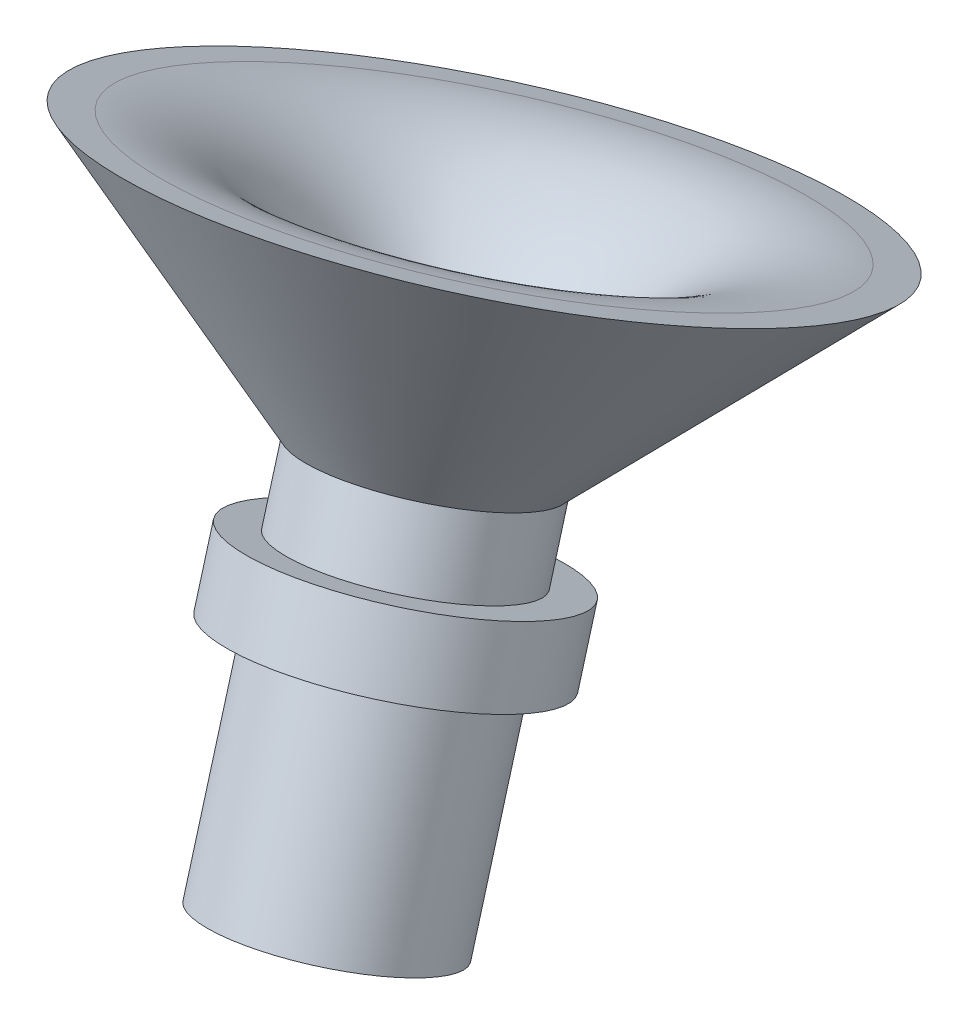
ISO-10303-21;
HEADER;
FILE_DESCRIPTION(('STEP AP214'),'2;1');
FILE_NAME('part.step','',(''),(''),'','','');
FILE_SCHEMA(('AUTOMOTIVE_DESIGN { 1 0 10303 214 1 1 1 1 }'));
ENDSEC;
DATA;
#1=APPLICATION_CONTEXT('core data for automotive mechanical design processes');
#2=APPLICATION_PROTOCOL_DEFINITION('international standard','automotive_design',2000,#1);
#3=PRODUCT_CONTEXT('',#1,'mechanical');
#4=PRODUCT('Part','Part','',(#3));
#5=PRODUCT_RELATED_PRODUCT_CATEGORY('part','',(#4));
#6=PRODUCT_DEFINITION_FORMATION('','',#4);
#7=PRODUCT_DEFINITION_CONTEXT('part definition',#1,'design');
#8=PRODUCT_DEFINITION('design','',#6,#7);
#9=PRODUCT_DEFINITION_SHAPE('','',#8);
#10=(LENGTH_UNIT() NAMED_UNIT(*) SI_UNIT(.MILLI.,.METRE.));
#11=(NAMED_UNIT(*) PLANE_ANGLE_UNIT() SI_UNIT($,.RADIAN.));
#12=(NAMED_UNIT(*) SI_UNIT($,.STERADIAN.) SOLID_ANGLE_UNIT());
#13=UNCERTAINTY_MEASURE_WITH_UNIT(LENGTH_MEASURE(1.E-05),#10,'distance_accuracy_value','');
#14=(GEOMETRIC_REPRESENTATION_CONTEXT(3) GLOBAL_UNCERTAINTY_ASSIGNED_CONTEXT((#13)) GLOBAL_UNIT_ASSIGNED_CONTEXT((#10,
#11,#12)) REPRESENTATION_CONTEXT('',''));
#15=CARTESIAN_POINT('',(0.,0.,0.));
#16=DIRECTION('',(0.,0.,1.));
#17=DIRECTION('',(1.,0.,0.));
#18=AXIS2_PLACEMENT_3D('',#15,#16,#17);
#19=CARTESIAN_POINT('',(-20.1513332773474,35.9151658884174,4.65068208851449));
#20=DIRECTION('',(0.10380954475083,-0.916038966713815,0.387422495320692));
#21=DIRECTION('',(0.,0.389527034298012,0.921015032206856));
#22=AXIS2_PLACEMENT_3D('',#19,#20,#21);
#23=PLANE('',#22);
#24=CARTESIAN_POINT('',(-17.2535557984802,35.9151658884174,3.87422495320692));
#25=DIRECTION('',(-0.10380954475083,0.916038966713815,-0.387422495320692));
#26=DIRECTION('',(0.,0.389527034298012,0.921015032206856));
#27=AXIS2_PLACEMENT_3D('',#24,#25,#26);
#28=CIRCLE('',#27,3.);
#29=CARTESIAN_POINT('',(-17.2535557984802,37.0837469913114,6.63727004982749));
#30=VERTEX_POINT('',#29);
#31=EDGE_CURVE('E10',#30,#30,#28,.T.);
#32=ORIENTED_EDGE('',*,*,#31,.F.);
#33=EDGE_LOOP('',(#32));
#34=FACE_BOUND('',#33,.T.);
#35=CARTESIAN_POINT('',(-17.2535557984802,35.9151658884174,3.87422495320692));
#36=DIRECTION('',(-0.10380954475083,0.916038966713815,-0.387422495320692));
#37=DIRECTION('',(0.,0.389527034298012,0.921015032206856));
#38=AXIS2_PLACEMENT_3D('',#35,#36,#37);
#39=CIRCLE('',#38,2.05);
#40=CARTESIAN_POINT('',(-17.2535557984802,36.7136963087283,5.76230576923098));
#41=VERTEX_POINT('',#40);
#42=EDGE_CURVE('E85',#41,#41,#39,.T.);
#43=ORIENTED_EDGE('',*,*,#42,.T.);
#44=EDGE_LOOP('',(#43));
#45=FACE_BOUND('',#44,.T.);
#46=ADVANCED_FACE('F39',(#34,#45),#23,.T.);
#47=CARTESIAN_POINT('',(-17.2535557984802,35.9151658884174,3.87422495320692));
#48=DIRECTION('',(0.10380954475083,-0.916038966713815,0.387422495320692));
#49=DIRECTION('',(0.,0.389527034298012,0.921015032206856));
#50=AXIS2_PLACEMENT_3D('',#47,#48,#49);
#51=CYLINDRICAL_SURFACE('',#50,3.);
#52=CARTESIAN_POINT('',(-17.8764130669852,41.4113996887003,1.54968998128277));
#53=DIRECTION('',(-0.10380954475083,0.916038966713815,-0.387422495320692));
#54=DIRECTION('',(0.,0.389527034298012,0.921015032206856));
#55=AXIS2_PLACEMENT_3D('',#52,#53,#54);
#56=CIRCLE('',#55,3.);
#57=CARTESIAN_POINT('',(-17.8764130669852,42.5799807915943,4.31273507790334));
#58=VERTEX_POINT('',#57);
#59=EDGE_CURVE('E44',#58,#58,#56,.T.);
#60=ORIENTED_EDGE('',*,*,#59,.F.);
#61=EDGE_LOOP('',(#60));
#62=FACE_BOUND('',#61,.T.);
#63=ORIENTED_EDGE('',*,*,#31,.T.);
#64=EDGE_LOOP('',(#63));
#65=FACE_BOUND('',#64,.T.);
#66=ADVANCED_FACE('F121',(#62,#65),#51,.T.);
#67=CARTESIAN_POINT('',(-21.7401163721415,41.4113996887003,2.58496616169287));
#68=DIRECTION('',(0.10380954475083,-0.916038966713815,0.387422495320692));
#69=DIRECTION('',(0.,0.389527034298012,0.921015032206856));
#70=AXIS2_PLACEMENT_3D('',#67,#68,#69);
#71=PLANE('',#70);
#72=CARTESIAN_POINT('',(-17.8764130669852,41.4113996887003,1.54968998128277));
#73=DIRECTION('',(-0.10380954475083,0.916038966713815,-0.387422495320692));
#74=DIRECTION('',(0.,0.389527034298012,0.921015032206856));
#75=AXIS2_PLACEMENT_3D('',#72,#73,#74);
#76=CIRCLE('',#75,3.99999999999999);
#77=CARTESIAN_POINT('',(-17.8764130669852,42.9695078258923,5.23375011011019));
#78=VERTEX_POINT('',#77);
#79=EDGE_CURVE('E47',#78,#78,#76,.T.);
#80=ORIENTED_EDGE('',*,*,#79,.F.);
#81=EDGE_LOOP('',(#80));
#82=FACE_BOUND('',#81,.T.);
#83=ORIENTED_EDGE('',*,*,#59,.T.);
#84=EDGE_LOOP('',(#83));
#85=FACE_BOUND('',#84,.T.);
#86=ADVANCED_FACE('F125',(#82,#85),#71,.T.);
#87=CARTESIAN_POINT('',(-17.2535557984802,35.9151658884174,3.87422495320692));
#88=DIRECTION('',(0.10380954475083,-0.916038966713815,0.387422495320692));
#89=DIRECTION('',(0.,0.389527034298012,0.921015032206856));
#90=AXIS2_PLACEMENT_3D('',#87,#88,#89);
#91=CYLINDRICAL_SURFACE('',#90,4.);
#92=CARTESIAN_POINT('',(-18.0840321564869,43.2434776221279,0.774844990641381));
#93=DIRECTION('',(-0.10380954475083,0.916038966713815,-0.387422495320692));
#94=DIRECTION('',(0.,0.389527034298012,0.921015032206856));
#95=AXIS2_PLACEMENT_3D('',#92,#93,#94);
#96=CIRCLE('',#95,4.);
#97=CARTESIAN_POINT('',(-18.0840321564869,44.80158575932,4.4589051194688));
#98=VERTEX_POINT('',#97);
#99=EDGE_CURVE('E52',#98,#98,#96,.T.);
#100=ORIENTED_EDGE('',*,*,#99,.F.);
#101=EDGE_LOOP('',(#100));
#102=FACE_BOUND('',#101,.T.);
#103=ORIENTED_EDGE('',*,*,#79,.T.);
#104=EDGE_LOOP('',(#103));
#105=FACE_BOUND('',#104,.T.);
#106=ADVANCED_FACE('F117',(#102,#105),#91,.T.);
#107=CARTESIAN_POINT('',(-20.9818096353541,43.2434776221279,1.55130212594895));
#108=DIRECTION('',(-0.10380954475083,0.916038966713815,-0.387422495320692));
#109=DIRECTION('',(0.,-0.389527034298012,-0.921015032206856));
#110=AXIS2_PLACEMENT_3D('',#107,#108,#109);
#111=PLANE('',#110);
#112=CARTESIAN_POINT('',(-18.0840321564869,43.2434776221279,0.774844990641381));
#113=DIRECTION('',(-0.10380954475083,0.916038966713815,-0.387422495320692));
#114=DIRECTION('',(0.,0.389527034298012,0.921015032206856));
#115=AXIS2_PLACEMENT_3D('',#112,#113,#114);
#116=CIRCLE('',#115,3.);
#117=CARTESIAN_POINT('',(-18.0840321564869,44.412058725022,3.53789008726195));
#118=VERTEX_POINT('',#117);
#119=EDGE_CURVE('E59',#118,#118,#116,.T.);
#120=ORIENTED_EDGE('',*,*,#119,.F.);
#121=EDGE_LOOP('',(#120));
#122=FACE_BOUND('',#121,.T.);
#123=ORIENTED_EDGE('',*,*,#99,.T.);
#124=EDGE_LOOP('',(#123));
#125=FACE_BOUND('',#124,.T.);
#126=ADVANCED_FACE('F111',(#122,#125),#111,.T.);
#127=CARTESIAN_POINT('',(-17.2535557984802,35.9151658884174,3.87422495320692));
#128=DIRECTION('',(0.10380954475083,-0.916038966713815,0.387422495320692));
#129=DIRECTION('',(0.,0.389527034298012,0.921015032206856));
#130=AXIS2_PLACEMENT_3D('',#127,#128,#129);
#131=CYLINDRICAL_SURFACE('',#130,3.);
#132=CARTESIAN_POINT('',(-18.2916512459885,45.0755555555555,0.));
#133=DIRECTION('',(-0.10380954475083,0.916038966713815,-0.387422495320692));
#134=DIRECTION('',(0.,0.389527034298012,0.921015032206856));
#135=AXIS2_PLACEMENT_3D('',#132,#133,#134);
#136=CIRCLE('',#135,3.);
#137=CARTESIAN_POINT('',(-18.2916512459885,43.9069744526615,-2.76304509662056));
#138=VERTEX_POINT('',#137);
#139=EDGE_CURVE('E61',#138,#138,#136,.T.);
#140=ORIENTED_EDGE('',*,*,#139,.F.);
#141=EDGE_LOOP('',(#140));
#142=FACE_BOUND('',#141,.T.);
#143=ORIENTED_EDGE('',*,*,#119,.T.);
#144=EDGE_LOOP('',(#143));
#145=FACE_BOUND('',#144,.T.);
#146=ADVANCED_FACE('F109',(#142,#145),#131,.T.);
#147=CARTESIAN_POINT('',(-18.2916512459885,45.0755555555555,0.));
#148=DIRECTION('',(-0.10380954475083,0.916038966713815,-0.387422495320692));
#149=DIRECTION('',(0.,-0.389527034298012,-0.921015032206856));
#150=AXIS2_PLACEMENT_3D('',#147,#148,#149);
#151=CONICAL_SURFACE('',#150,3.,0.793662438057099);
#152=CARTESIAN_POINT('',(-18.9145085144935,50.5717893558384,-2.32453497192415));
#153=DIRECTION('',(-0.10380954475083,0.916038966713815,-0.387422495320692));
#154=DIRECTION('',(0.,0.389527034298012,0.921015032206856));
#155=AXIS2_PLACEMENT_3D('',#152,#153,#154);
#156=CIRCLE('',#155,9.09999999999999);
#157=CARTESIAN_POINT('',(-18.9145085144935,47.0270933437265,-10.7057717650065));
#158=VERTEX_POINT('',#157);
#159=EDGE_CURVE('E63',#158,#158,#156,.T.);
#160=CARTESIAN_POINT('',(-18.9145085144935,47.0270933437265,-10.7057717650065));
#161=CARTESIAN_POINT('',(-18.9080204179466,46.9945921052779,-10.6230350288775));
#162=CARTESIAN_POINT('',(-18.9015323213996,46.9620908668293,-10.5402982927485));
#163=CARTESIAN_POINT('',(-18.8885561283058,46.8970883899322,-10.3748248204904));
#164=CARTESIAN_POINT('',(-18.8820680317589,46.8645871514836,-10.2920880843614));
#165=CARTESIAN_POINT('',(-18.869091838665,46.7995846745864,-10.1266146121034));
#166=CARTESIAN_POINT('',(-18.8626037421181,46.7670834361378,-10.0438778759744));
#167=CARTESIAN_POINT('',(-18.8496275490242,46.7020809592406,-9.87840440371632));
#168=CARTESIAN_POINT('',(-18.8431394524773,46.669579720792,-9.7956676675873));
#169=CARTESIAN_POINT('',(-18.8301632593835,46.6045772438948,-9.63019419532927));
#170=CARTESIAN_POINT('',(-18.8236751628365,46.5720760054462,-9.54745745920024));
#171=CARTESIAN_POINT('',(-18.8106989697427,46.507073528549,-9.3819839869422));
#172=CARTESIAN_POINT('',(-18.8042108731957,46.4745722901004,-9.29924725081318));
#173=CARTESIAN_POINT('',(-18.7912346801019,46.4095698132032,-9.13377377855514));
#174=CARTESIAN_POINT('',(-18.784746583555,46.3770685747547,-9.05103704242612));
#175=CARTESIAN_POINT('',(-18.7717703904611,46.3120660978575,-8.88556357016808));
#176=CARTESIAN_POINT('',(-18.7652822939142,46.2795648594089,-8.80282683403906));
#177=CARTESIAN_POINT('',(-18.7523061008203,46.2145623825117,-8.63735336178102));
#178=CARTESIAN_POINT('',(-18.7458180042734,46.1820611440631,-8.554616625652));
#179=CARTESIAN_POINT('',(-18.7328418111795,46.1170586671659,-8.38914315339396));
#180=CARTESIAN_POINT('',(-18.7263537146326,46.0845574287173,-8.30640641726493));
#181=CARTESIAN_POINT('',(-18.7133775215388,46.0195549518201,-8.14093294500689));
#182=CARTESIAN_POINT('',(-18.7068894249918,45.9870537133715,-8.05819620887787));
#183=CARTESIAN_POINT('',(-18.693913231898,45.9220512364743,-7.89272273661983));
#184=CARTESIAN_POINT('',(-18.6874251353511,45.8895499980257,-7.80998600049081));
#185=CARTESIAN_POINT('',(-18.6744489422572,45.8245475211286,-7.64451252823277));
#186=CARTESIAN_POINT('',(-18.6679608457103,45.79204628268,-7.56177579210375));
#187=CARTESIAN_POINT('',(-18.6549846526164,45.7270438057828,-7.39630231984571));
#188=CARTESIAN_POINT('',(-18.6484965560695,45.6945425673342,-7.31356558371669));
#189=CARTESIAN_POINT('',(-18.6355203629756,45.629540090437,-7.14809211145865));
#190=CARTESIAN_POINT('',(-18.6290322664287,45.5970388519884,-7.06535537532963));
#191=CARTESIAN_POINT('',(-18.6160560733349,45.5320363750912,-6.89988190307159));
#192=CARTESIAN_POINT('',(-18.6095679767879,45.4995351366426,-6.81714516694257));
#193=CARTESIAN_POINT('',(-18.5965917836941,45.4345326597454,-6.65167169468452));
#194=CARTESIAN_POINT('',(-18.5901036871472,45.4020314212968,-6.5689349585555));
#195=CARTESIAN_POINT('',(-18.5771274940533,45.3370289443996,-6.40346148629746));
#196=CARTESIAN_POINT('',(-18.5706393975064,45.3045277059511,-6.32072475016844));
#197=CARTESIAN_POINT('',(-18.5576632044125,45.2395252290539,-6.1552512779104));
#198=CARTESIAN_POINT('',(-18.5511751078656,45.2070239906053,-6.07251454178138));
#199=CARTESIAN_POINT('',(-18.5381989147717,45.1420215137081,-5.90704106952334));
#200=CARTESIAN_POINT('',(-18.5317108182248,45.1095202752595,-5.82430433339432));
#201=CARTESIAN_POINT('',(-18.518734625131,45.0445177983623,-5.65883086113628));
#202=CARTESIAN_POINT('',(-18.512246528584,45.0120165599137,-5.57609412500726));
#203=CARTESIAN_POINT('',(-18.4992703354902,44.9470140830165,-5.41062065274922));
#204=CARTESIAN_POINT('',(-18.4927822389432,44.9145128445679,-5.3278839166202));
#205=CARTESIAN_POINT('',(-18.4798060458494,44.8495103676707,-5.16241044436216));
#206=CARTESIAN_POINT('',(-18.4733179493025,44.8170091292221,-5.07967370823314));
#207=CARTESIAN_POINT('',(-18.4603417562086,44.752006652325,-4.91420023597509));
#208=CARTESIAN_POINT('',(-18.4538536596617,44.7195054138764,-4.83146349984607));
#209=CARTESIAN_POINT('',(-18.4408774665678,44.6545029369792,-4.66599002758803));
#210=CARTESIAN_POINT('',(-18.4343893700209,44.6220016985306,-4.58325329145901));
#211=CARTESIAN_POINT('',(-18.4214131769271,44.5569992216334,-4.41777981920097));
#212=CARTESIAN_POINT('',(-18.4149250803801,44.5244979831848,-4.33504308307195));
#213=CARTESIAN_POINT('',(-18.4019488872863,44.4594955062876,-4.16956961081391));
#214=CARTESIAN_POINT('',(-18.3954607907393,44.426994267839,-4.08683287468489));
#215=CARTESIAN_POINT('',(-18.3824845976455,44.3619917909418,-3.92135940242685));
#216=CARTESIAN_POINT('',(-18.3759965010986,44.3294905524932,-3.83862266629783));
#217=CARTESIAN_POINT('',(-18.3630203080047,44.264488075596,-3.67314919403979));
#218=CARTESIAN_POINT('',(-18.3565322114578,44.2319868371475,-3.59041245791077));
#219=CARTESIAN_POINT('',(-18.3435560183639,44.1669843602503,-3.42493898565273));
#220=CARTESIAN_POINT('',(-18.337067921817,44.1344831218017,-3.34220224952371));
#221=CARTESIAN_POINT('',(-18.3240917287232,44.0694806449045,-3.17672877726566));
#222=CARTESIAN_POINT('',(-18.3176036321762,44.0369794064559,-3.09399204113664));
#223=CARTESIAN_POINT('',(-18.3046274390824,43.9719769295587,-2.9285185688786));
#224=CARTESIAN_POINT('',(-18.2981393425354,43.9394756911101,-2.84578183274958));
#225=CARTESIAN_POINT('',(-18.2916512459885,43.9069744526615,-2.76304509662056));
#226=B_SPLINE_CURVE_WITH_KNOTS('',3,(#160,#161,#162,#163,#164,#165,#166,#167,#168,#169,#170,
#171,#172,#173,#174,#175,#176,#177,#178,#179,#180,#181,#182,#183,#184,#185,#186,#187,#188,#189,
#190,#191,#192,#193,#194,#195,#196,#197,#198,#199,#200,#201,#202,#203,#204,#205,#206,#207,#208,
#209,#210,#211,#212,#213,#214,#215,#216,#217,#218,#219,#220,#221,#222,#223,#224,#225),
.UNSPECIFIED.,.F.,.F.,(4,2,2,2,2,2,2,2,2,2,2,2,2,2,2,2,2,2,2,2,2,2,2,2,2,2,2,2,2,2,2,2,4),(0.,
0.267383882507905,0.534767765015809,0.802151647523712,1.06953553003161,1.33691941253951,
1.60430329504742,1.87168717755532,2.13907106006323,2.40645494257113,2.67383882507903,
2.94122270758693,3.20860659009484,3.47599047260274,3.74337435511064,4.01075823761855,
4.27814212012645,4.54552600263435,4.81290988514225,5.08029376765015,5.34767765015805,
5.61506153266596,5.88244541517386,6.14982929768176,6.41721318018967,6.68459706269757,
6.95198094520547,7.21936482771337,7.48674871022128,7.75413259272918,8.02151647523708,
8.28890035774499,8.55628424025289),.UNSPECIFIED.);
#227=EDGE_CURVE('BSEAM106',#158,#138,#226,.T.);
#228=ORIENTED_EDGE('',*,*,#159,.F.);
#229=ORIENTED_EDGE('',*,*,#139,.T.);
#230=ORIENTED_EDGE('',*,*,#227,.T.);
#231=ORIENTED_EDGE('',*,*,#227,.F.);
#232=EDGE_LOOP('',(#228,#230,#229,#231));
#233=FACE_BOUND('',#232,.T.);
#234=ADVANCED_FACE('F106',(#233),#151,.T.);
#235=CARTESIAN_POINT('',(-26.7385077074349,50.5717893558384,-0.22810070659372));
#236=DIRECTION('',(-0.10380954475083,0.916038966713815,-0.387422495320692));
#237=DIRECTION('',(0.,-0.389527034298012,-0.921015032206856));
#238=AXIS2_PLACEMENT_3D('',#235,#236,#237);
#239=PLANE('',#238);
#240=CARTESIAN_POINT('',(-18.9145085144935,50.5717893558384,-2.32453497192416));
#241=DIRECTION('',(-0.10380954475083,0.916038966713815,-0.387422495320692));
#242=DIRECTION('',(0.,0.389527034298012,0.921015032206856));
#243=AXIS2_PLACEMENT_3D('',#240,#241,#242);
#244=CIRCLE('',#243,8.1);
#245=CARTESIAN_POINT('',(-18.9145085144935,53.7269583336523,5.13568678895138));
#246=VERTEX_POINT('',#245);
#247=EDGE_CURVE('E70',#246,#246,#244,.T.);
#248=ORIENTED_EDGE('',*,*,#247,.F.);
#249=EDGE_LOOP('',(#248));
#250=FACE_BOUND('',#249,.T.);
#251=ORIENTED_EDGE('',*,*,#159,.T.);
#252=EDGE_LOOP('',(#251));
#253=FACE_BOUND('',#252,.T.);
#254=ADVANCED_FACE('F105',(#250,#253),#239,.T.);
#255=CARTESIAN_POINT('',(-18.2916512459885,45.0755555555556,0.));
#256=DIRECTION('',(0.10380954475083,-0.916038966713815,0.387422495320692));
#257=DIRECTION('',(0.,0.389527034298012,0.921015032206856));
#258=AXIS2_PLACEMENT_3D('',#255,#256,#257);
#259=TOROIDAL_SURFACE('',#258,8.1,6.);
#260=CARTESIAN_POINT('',(-18.2916512459885,45.0755555555556,0.));
#261=DIRECTION('',(-0.10380954475083,0.916038966713815,-0.387422495320692));
#262=DIRECTION('',(0.,0.389527034298012,0.921015032206856));
#263=AXIS2_PLACEMENT_3D('',#260,#261,#262);
#264=CIRCLE('',#263,2.1);
#265=CARTESIAN_POINT('',(-18.2916512459885,45.8935623275814,1.93413156763439));
#266=VERTEX_POINT('',#265);
#267=EDGE_CURVE('E66',#266,#266,#264,.T.);
#268=ORIENTED_EDGE('',*,*,#267,.F.);
#269=EDGE_LOOP('',(#268));
#270=FACE_BOUND('',#269,.T.);
#271=ORIENTED_EDGE('',*,*,#247,.T.);
#272=EDGE_LOOP('',(#271));
#273=FACE_BOUND('',#272,.T.);
#274=ADVANCED_FACE('F100',(#270,#273),#259,.T.);
#275=CARTESIAN_POINT('',(-20.3200954811956,45.0755555555556,0.543519994715306));
#276=CARTESIAN_POINT('',(-20.2508891180283,44.4648629110797,0.801801658262434));
#277=CARTESIAN_POINT('',(-19.215756928572,43.8541702666038,0.801264276707037));
#278=CARTESIAN_POINT('',(-19.1465505654048,43.2434776221279,1.05954594025416));
#279=B_SPLINE_CURVE_WITH_KNOTS('',3,(#275,#276,#277,#278),.UNSPECIFIED.,.F.,.F.,(4,4),(0.,1.),.UNSPECIFIED.);
#280=CARTESIAN_POINT('',(-17.2535557984802,35.9151658884174,3.87422495320692));
#281=DIRECTION('',(0.10380954475083,-0.916038966713815,0.387422495320692));
#282=AXIS1_PLACEMENT('',#280,#281);
#283=SURFACE_OF_REVOLUTION('',#279,#282);
#284=CARTESIAN_POINT('',(-18.0840321564869,43.2434776221279,0.774844990641378));
#285=DIRECTION('',(-0.10380954475083,0.916038966713815,-0.387422495320692));
#286=DIRECTION('',(0.,0.389527034298012,0.921015032206856));
#287=AXIS2_PLACEMENT_3D('',#284,#285,#286);
#288=CIRCLE('',#287,1.09999999999999);
#289=CARTESIAN_POINT('',(-18.0840321564869,43.6719573598558,1.78796152606891));
#290=VERTEX_POINT('',#289);
#291=EDGE_CURVE('E71',#290,#290,#288,.T.);
#292=ORIENTED_EDGE('',*,*,#291,.F.);
#293=EDGE_LOOP('',(#292));
#294=FACE_BOUND('',#293,.T.);
#295=ORIENTED_EDGE('',*,*,#267,.T.);
#296=EDGE_LOOP('',(#295));
#297=FACE_BOUND('',#296,.T.);
#298=ADVANCED_FACE('F95',(#294,#297),#283,.F.);
#299=CARTESIAN_POINT('',(-17.2535557984802,35.9151658884174,3.87422495320692));
#300=DIRECTION('',(0.10380954475083,-0.916038966713815,0.387422495320692));
#301=DIRECTION('',(0.,0.389527034298012,0.921015032206856));
#302=AXIS2_PLACEMENT_3D('',#299,#300,#301);
#303=CYLINDRICAL_SURFACE('',#302,1.09999999999999);
#304=CARTESIAN_POINT('',(-17.6687939774835,39.5793217552727,2.32453497192415));
#305=DIRECTION('',(-0.10380954475083,0.916038966713815,-0.387422495320692));
#306=DIRECTION('',(0.,0.389527034298012,0.921015032206856));
#307=AXIS2_PLACEMENT_3D('',#304,#305,#306);
#308=CIRCLE('',#307,1.1);
#309=CARTESIAN_POINT('',(-17.6687939774835,40.0078014930005,3.33765150735169));
#310=VERTEX_POINT('',#309);
#311=EDGE_CURVE('E76',#310,#310,#308,.T.);
#312=ORIENTED_EDGE('',*,*,#311,.F.);
#313=EDGE_LOOP('',(#312));
#314=FACE_BOUND('',#313,.T.);
#315=ORIENTED_EDGE('',*,*,#291,.T.);
#316=EDGE_LOOP('',(#315));
#317=FACE_BOUND('',#316,.T.);
#318=ADVANCED_FACE('F96',(#314,#317),#303,.F.);
#319=CARTESIAN_POINT('',(-19.6489419213761,39.5793217552727,2.85511401438433));
#320=DIRECTION('',(0.10380954475083,-0.916038966713815,0.387422495320692));
#321=DIRECTION('',(0.,0.389527034298012,0.921015032206856));
#322=AXIS2_PLACEMENT_3D('',#319,#320,#321);
#323=PLANE('',#322);
#324=CARTESIAN_POINT('',(-17.6687939774835,39.5793217552727,2.32453497192415));
#325=DIRECTION('',(-0.10380954475083,0.916038966713815,-0.387422495320692));
#326=DIRECTION('',(0.,0.389527034298012,0.921015032206856));
#327=AXIS2_PLACEMENT_3D('',#324,#325,#326);
#328=CIRCLE('',#327,2.04999999999999);
#329=CARTESIAN_POINT('',(-17.6687939774835,40.3778521755836,4.2126157879482));
#330=VERTEX_POINT('',#329);
#331=EDGE_CURVE('E78',#330,#330,#328,.T.);
#332=ORIENTED_EDGE('',*,*,#331,.F.);
#333=EDGE_LOOP('',(#332));
#334=FACE_BOUND('',#333,.T.);
#335=ORIENTED_EDGE('',*,*,#311,.T.);
#336=EDGE_LOOP('',(#335));
#337=FACE_BOUND('',#336,.T.);
#338=ADVANCED_FACE('F143',(#334,#337),#323,.T.);
#339=CARTESIAN_POINT('',(-17.2535557984802,35.9151658884174,3.87422495320692));
#340=DIRECTION('',(0.10380954475083,-0.916038966713815,0.387422495320692));
#341=DIRECTION('',(0.,0.389527034298012,0.921015032206856));
#342=AXIS2_PLACEMENT_3D('',#339,#340,#341);
#343=CYLINDRICAL_SURFACE('',#342,2.05);
#344=ORIENTED_EDGE('',*,*,#42,.F.);
#345=EDGE_LOOP('',(#344));
#346=FACE_BOUND('',#345,.T.);
#347=ORIENTED_EDGE('',*,*,#331,.T.);
#348=EDGE_LOOP('',(#347));
#349=FACE_BOUND('',#348,.T.);
#350=ADVANCED_FACE('F138',(#346,#349),#343,.F.);
#351=CLOSED_SHELL('',(#46,#66,#86,#106,#126,#146,#234,#254,#274,#298,#318,#338,#350));
#352=MANIFOLD_SOLID_BREP('B2',#351);
#353=ADVANCED_BREP_SHAPE_REPRESENTATION('',(#18,#352),#14);
#354=SHAPE_DEFINITION_REPRESENTATION(#9,#353);
ENDSEC;
END-ISO-10303-21;
